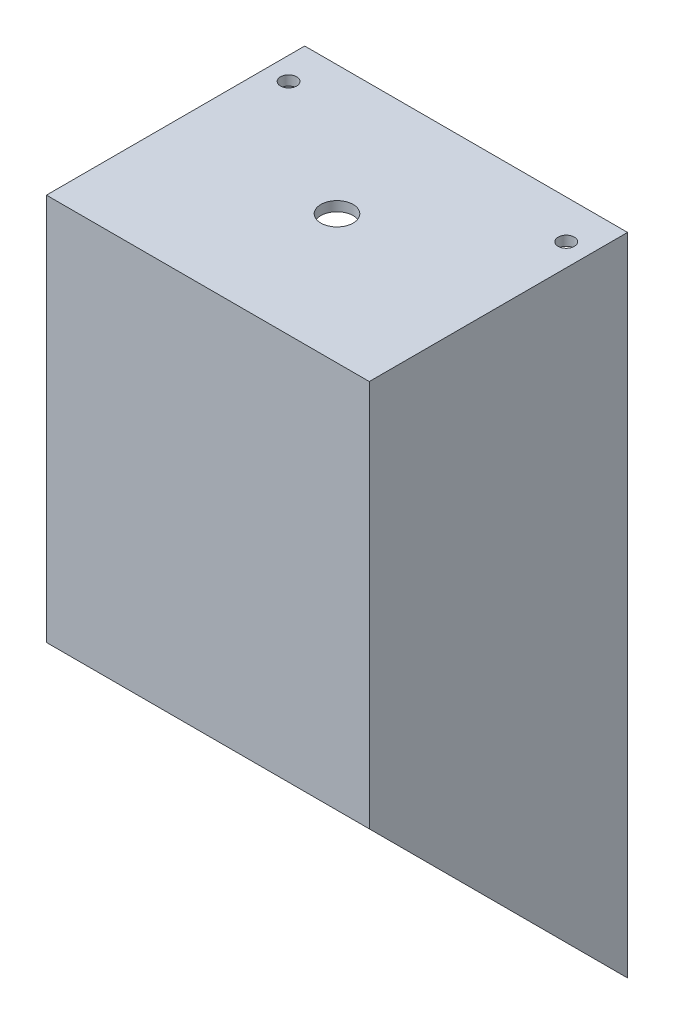
ISO-10303-21;
HEADER;
FILE_DESCRIPTION(('STEP AP214'),'2;1');
FILE_NAME('part.step','',(''),(''),'','','');
FILE_SCHEMA(('AUTOMOTIVE_DESIGN { 1 0 10303 214 1 1 1 1 }'));
ENDSEC;
DATA;
#1=APPLICATION_CONTEXT('core data for automotive mechanical design processes');
#2=APPLICATION_PROTOCOL_DEFINITION('international standard','automotive_design',2000,#1);
#3=PRODUCT_CONTEXT('',#1,'mechanical');
#4=PRODUCT('Part','Part','',(#3));
#5=PRODUCT_RELATED_PRODUCT_CATEGORY('part','',(#4));
#6=PRODUCT_DEFINITION_FORMATION('','',#4);
#7=PRODUCT_DEFINITION_CONTEXT('part definition',#1,'design');
#8=PRODUCT_DEFINITION('design','',#6,#7);
#9=PRODUCT_DEFINITION_SHAPE('','',#8);
#10=(LENGTH_UNIT() NAMED_UNIT(*) SI_UNIT(.MILLI.,.METRE.));
#11=(NAMED_UNIT(*) PLANE_ANGLE_UNIT() SI_UNIT($,.RADIAN.));
#12=(NAMED_UNIT(*) SI_UNIT($,.STERADIAN.) SOLID_ANGLE_UNIT());
#13=UNCERTAINTY_MEASURE_WITH_UNIT(LENGTH_MEASURE(1.E-05),#10,'distance_accuracy_value','');
#14=(GEOMETRIC_REPRESENTATION_CONTEXT(3) GLOBAL_UNCERTAINTY_ASSIGNED_CONTEXT((#13)) GLOBAL_UNIT_ASSIGNED_CONTEXT((#10,
#11,#12)) REPRESENTATION_CONTEXT('',''));
#15=CARTESIAN_POINT('',(0.,0.,0.));
#16=DIRECTION('',(0.,0.,1.));
#17=DIRECTION('',(1.,0.,0.));
#18=AXIS2_PLACEMENT_3D('',#15,#16,#17);
#19=CARTESIAN_POINT('',(0.,-25.,25.));
#20=DIRECTION('',(0.,-0.707106781186547,0.707106781186548));
#21=DIRECTION('',(0.,-0.707106781186548,-0.707106781186547));
#22=AXIS2_PLACEMENT_3D('',#19,#20,#21);
#23=PLANE('',#22);
#24=CARTESIAN_POINT('',(22.5,-30.0000000000001,20.0000000000002));
#25=CARTESIAN_POINT('',(22.5,-28.9587079494324,21.0412920505679));
#26=CARTESIAN_POINT('',(22.2099212789531,-26.8761238482968,23.1238761517032));
#27=CARTESIAN_POINT('',(20.9212883781001,-23.8722965052138,26.1277034947862));
#28=CARTESIAN_POINT('',(18.8286620976702,-21.1039533709797,28.8960466290205));
#29=CARTESIAN_POINT('',(16.0124608920624,-18.6774803197384,31.3225196802619));
#30=CARTESIAN_POINT('',(12.580909794264,-16.6861253500673,33.3138746499327));
#31=CARTESIAN_POINT('',(8.66588138852767,-15.2064151166863,34.7935848833141));
#32=CARTESIAN_POINT('',(4.41782802091241,-14.2952140540327,35.7047859459672));
#33=CARTESIAN_POINT('',(0.,-13.9875391079377,36.0124608920627));
#34=CARTESIAN_POINT('',(-4.41782802091241,-14.2952140540329,35.7047859459674));
#35=CARTESIAN_POINT('',(-8.66588138852768,-15.2064151166861,34.7935848833139));
#36=CARTESIAN_POINT('',(-12.580909794264,-16.6861253500673,33.313874649933));
#37=CARTESIAN_POINT('',(-16.0124608920624,-18.6774803197383,31.3225196802619));
#38=CARTESIAN_POINT('',(-18.8286620976703,-21.1039533709796,28.8960466290202));
#39=CARTESIAN_POINT('',(-20.9212883781001,-23.8722965052138,26.1277034947865));
#40=CARTESIAN_POINT('',(-22.2099212789531,-26.8761238482967,23.1238761517033));
#41=CARTESIAN_POINT('',(-22.6450393605234,-30.,20.0000000000001));
#42=CARTESIAN_POINT('',(-22.2099212789532,-33.123876151703,16.8761238482971));
#43=CARTESIAN_POINT('',(-20.9212883781001,-36.1277034947862,13.8722965052139));
#44=CARTESIAN_POINT('',(-18.8286620976703,-38.8960466290201,11.1039533709798));
#45=CARTESIAN_POINT('',(-16.0124608920624,-41.3225196802616,8.67748031973836));
#46=CARTESIAN_POINT('',(-12.5809097942641,-43.3138746499329,6.68612535006741));
#47=CARTESIAN_POINT('',(-8.66588138852768,-44.7935848833139,5.20641511668618));
#48=CARTESIAN_POINT('',(-4.41782802091242,-45.7047859459672,4.29521405403288));
#49=CARTESIAN_POINT('',(0.,-46.0124608920625,3.9875391079377));
#50=CARTESIAN_POINT('',(4.4178280209124,-45.7047859459671,4.29521405403321));
#51=CARTESIAN_POINT('',(8.66588138852768,-44.793584883314,5.20641511668618));
#52=CARTESIAN_POINT('',(12.580909794264,-43.313874649933,6.68612535006752));
#53=CARTESIAN_POINT('',(16.0124608920624,-41.3225196802617,8.67748031973847));
#54=CARTESIAN_POINT('',(18.8286620976703,-38.8960466290201,11.1039533709796));
#55=CARTESIAN_POINT('',(20.9212883781001,-36.1277034947863,13.872296505214));
#56=CARTESIAN_POINT('',(22.2099212789531,-33.1238761517031,16.8761238482971));
#57=CARTESIAN_POINT('',(22.5,-31.0412920505678,18.9587079494325));
#58=CARTESIAN_POINT('',(22.5,-30.0000000000001,20.0000000000002));
#59=B_SPLINE_CURVE_WITH_KNOTS('',3,(#24,#25,#26,#27,#28,#29,#30,#31,#32,#33,#34,#35,#36,#37,#38,
#39,#40,#41,#42,#43,#44,#45,#46,#47,#48,#49,#50,#51,#52,#53,#54,#55,#56,#57,#58),.UNSPECIFIED.,
.T.,.F.,(4,1,1,1,1,1,1,1,1,1,1,1,1,1,1,1,1,1,1,1,1,1,1,1,1,1,1,1,1,1,1,1,4),(0.,
0.0312499999999997,0.0625000000000006,0.0937499999999999,0.125,0.15625,0.1875,0.21875,0.25,
0.28125,0.3125,0.34375,0.375,0.40625,0.4375,0.46875,0.5,0.53125,0.5625,0.59375,0.625,0.65625,
0.6875,0.71875,0.75,0.78125,0.8125,0.84375,0.875,0.90625,0.9375,0.96875,1.),.UNSPECIFIED.);
#60=CARTESIAN_POINT('',(22.5,-30.0000000000001,20.0000000000002));
#61=VERTEX_POINT('',#60);
#62=EDGE_CURVE('E269',#61,#61,#59,.F.);
#63=ORIENTED_EDGE('',*,*,#62,.T.);
#64=EDGE_LOOP('',(#63));
#65=FACE_BOUND('',#64,.T.);
#66=DIRECTION('',(0.,-0.707106781186548,-0.707106781186547));
#67=VECTOR('',#66,1.);
#68=CARTESIAN_POINT('',(-25.,-9.99999999999999,40.));
#69=LINE('',#68,#67);
#70=CARTESIAN_POINT('',(-25.,-9.99999999999999,40.));
#71=VERTEX_POINT('',#70);
#72=CARTESIAN_POINT('',(-25.,-50.,0.));
#73=VERTEX_POINT('',#72);
#74=EDGE_CURVE('E385',#71,#73,#69,.T.);
#75=ORIENTED_EDGE('',*,*,#74,.T.);
#76=DIRECTION('',(1.,0.,0.));
#77=VECTOR('',#76,1.);
#78=CARTESIAN_POINT('',(-25.,-50.,0.));
#79=LINE('',#78,#77);
#80=CARTESIAN_POINT('',(25.,-50.,0.));
#81=VERTEX_POINT('',#80);
#82=EDGE_CURVE('E435',#73,#81,#79,.T.);
#83=ORIENTED_EDGE('',*,*,#82,.T.);
#84=DIRECTION('',(0.,-0.707106781186548,-0.707106781186547));
#85=VECTOR('',#84,1.);
#86=CARTESIAN_POINT('',(25.,-9.99999999999999,40.));
#87=LINE('',#86,#85);
#88=CARTESIAN_POINT('',(25.,-9.99999999999999,40.));
#89=VERTEX_POINT('',#88);
#90=EDGE_CURVE('E391',#89,#81,#87,.T.);
#91=ORIENTED_EDGE('',*,*,#90,.F.);
#92=DIRECTION('',(1.,0.,0.));
#93=VECTOR('',#92,1.);
#94=CARTESIAN_POINT('',(-25.,-9.99999999999999,40.));
#95=LINE('',#94,#93);
#96=EDGE_CURVE('E352',#71,#89,#95,.T.);
#97=ORIENTED_EDGE('',*,*,#96,.F.);
#98=EDGE_LOOP('',(#75,#83,#91,#97));
#99=FACE_BOUND('',#98,.T.);
#100=DIRECTION('',(-0.377964473009235,-0.654653670707975,-0.654653670707975));
#101=VECTOR('',#100,1.);
#102=CARTESIAN_POINT('',(-5.6316316232872,-23.3742879831591,26.6257120168409));
#103=LINE('',#102,#101);
#104=CARTESIAN_POINT('',(-19.7766433543863,-47.87416697508,2.12583302492004));
#105=VERTEX_POINT('',#104);
#106=CARTESIAN_POINT('',(-20.4266433543863,-48.9999999999997,1.00000000000029));
#107=VERTEX_POINT('',#106);
#108=EDGE_CURVE('E234',#105,#107,#103,.T.);
#109=ORIENTED_EDGE('',*,*,#108,.T.);
#110=DIRECTION('',(-0.377964473009229,0.654653670707977,0.654653670707976));
#111=VECTOR('',#110,1.);
#112=CARTESIAN_POINT('',(-29.3854712699461,-33.4828548739838,16.5171451260162));
#113=LINE('',#112,#111);
#114=CARTESIAN_POINT('',(-21.0766433543863,-47.87416697508,2.12583302492004));
#115=VERTEX_POINT('',#114);
#116=EDGE_CURVE('E192',#107,#115,#113,.T.);
#117=ORIENTED_EDGE('',*,*,#116,.T.);
#118=DIRECTION('',(1.,0.,0.));
#119=VECTOR('',#118,1.);
#120=CARTESIAN_POINT('',(0.,-47.87416697508,2.12583302492004));
#121=LINE('',#120,#119);
#122=EDGE_CURVE('E243',#115,#105,#121,.T.);
#123=ORIENTED_EDGE('',*,*,#122,.T.);
#124=EDGE_LOOP('',(#109,#117,#123));
#125=FACE_BOUND('',#124,.T.);
#126=DIRECTION('',(-0.377964473009235,-0.654653670707975,-0.654653670707975));
#127=VECTOR('',#126,1.);
#128=CARTESIAN_POINT('',(11.5112255195699,-28.3230045762132,21.6769954237868));
#129=LINE('',#128,#127);
#130=CARTESIAN_POINT('',(0.223356645613727,-47.8741669750801,2.1258330249199));
#131=VERTEX_POINT('',#130);
#132=CARTESIAN_POINT('',(-0.42664335438628,-48.9999999999999,1.00000000000014));
#133=VERTEX_POINT('',#132);
#134=EDGE_CURVE('E247',#131,#133,#129,.T.);
#135=ORIENTED_EDGE('',*,*,#134,.T.);
#136=DIRECTION('',(-0.377964473009229,0.654653670707977,0.654653670707976));
#137=VECTOR('',#136,1.);
#138=CARTESIAN_POINT('',(-12.2426141270891,-28.5341382809298,21.4658617190702));
#139=LINE('',#138,#137);
#140=CARTESIAN_POINT('',(-1.07664335438629,-47.8741669750801,2.12583302491991));
#141=VERTEX_POINT('',#140);
#142=EDGE_CURVE('E253',#133,#141,#139,.T.);
#143=ORIENTED_EDGE('',*,*,#142,.T.);
#144=DIRECTION('',(1.,0.,0.));
#145=VECTOR('',#144,1.);
#146=CARTESIAN_POINT('',(0.,-47.8741669750801,2.12583302491991));
#147=LINE('',#146,#145);
#148=EDGE_CURVE('E250',#141,#131,#147,.T.);
#149=ORIENTED_EDGE('',*,*,#148,.T.);
#150=EDGE_LOOP('',(#135,#143,#149));
#151=FACE_BOUND('',#150,.T.);
#152=DIRECTION('',(-0.377964473009233,-0.654653670707976,-0.654653670707975));
#153=VECTOR('',#152,1.);
#154=CARTESIAN_POINT('',(28.654082662427,-33.2717211692671,16.7282788307329));
#155=LINE('',#154,#153);
#156=CARTESIAN_POINT('',(20.2233566456137,-47.8741669750802,2.12583302491977));
#157=VERTEX_POINT('',#156);
#158=CARTESIAN_POINT('',(19.5733566456137,-49.,1.));
#159=VERTEX_POINT('',#158);
#160=EDGE_CURVE('E256',#157,#159,#155,.T.);
#161=ORIENTED_EDGE('',*,*,#160,.T.);
#162=DIRECTION('',(-0.377964473009229,0.654653670707977,0.654653670707976));
#163=VECTOR('',#162,1.);
#164=CARTESIAN_POINT('',(4.90024301576794,-23.5854216878759,26.4145783121241));
#165=LINE('',#164,#163);
#166=CARTESIAN_POINT('',(18.9233566456137,-47.8741669750802,2.12583302491977));
#167=VERTEX_POINT('',#166);
#168=EDGE_CURVE('E262',#159,#167,#165,.T.);
#169=ORIENTED_EDGE('',*,*,#168,.T.);
#170=DIRECTION('',(1.,0.,0.));
#171=VECTOR('',#170,1.);
#172=CARTESIAN_POINT('',(0.,-47.8741669750802,2.12583302491976));
#173=LINE('',#172,#171);
#174=EDGE_CURVE('E259',#167,#157,#173,.T.);
#175=ORIENTED_EDGE('',*,*,#174,.T.);
#176=EDGE_LOOP('',(#161,#169,#175));
#177=FACE_BOUND('',#176,.T.);
#178=ADVANCED_FACE('F53',(#65,#99,#125,#151,#177),#23,.T.);
#179=CARTESIAN_POINT('',(0.,-23.9393398282202,23.9393398282202));
#180=DIRECTION('',(0.,-0.707106781186547,0.707106781186548));
#181=DIRECTION('',(0.,-0.707106781186548,-0.707106781186547));
#182=AXIS2_PLACEMENT_3D('',#179,#180,#181);
#183=PLANE('',#182);
#184=DIRECTION('',(-0.377964473009229,0.654653670707977,0.654653670707976));
#185=VECTOR('',#184,1.);
#186=CARTESIAN_POINT('',(-11.7177234679213,-27.3219552274672,20.5567244289732));
#187=LINE('',#186,#185);
#188=CARTESIAN_POINT('',(-0.426643354386285,-46.8786796564402,1.00000000000014));
#189=VERTEX_POINT('',#188);
#190=CARTESIAN_POINT('',(-1.07664335438629,-45.7528466315205,2.12583302491991));
#191=VERTEX_POINT('',#190);
#192=EDGE_CURVE('E206',#189,#191,#187,.T.);
#193=ORIENTED_EDGE('',*,*,#192,.F.);
#194=DIRECTION('',(-0.377964473009235,-0.654653670707975,-0.654653670707975));
#195=VECTOR('',#194,1.);
#196=CARTESIAN_POINT('',(10.9863348604021,-27.1108215227505,20.7678581336899));
#197=LINE('',#196,#195);
#198=CARTESIAN_POINT('',(0.22335664561373,-45.7528466315205,2.12583302491991));
#199=VERTEX_POINT('',#198);
#200=EDGE_CURVE('E198',#199,#189,#197,.T.);
#201=ORIENTED_EDGE('',*,*,#200,.F.);
#202=DIRECTION('',(1.,0.,0.));
#203=VECTOR('',#202,1.);
#204=CARTESIAN_POINT('',(0.,-45.7528466315205,2.1258330249199));
#205=LINE('',#204,#203);
#206=EDGE_CURVE('E200',#191,#199,#205,.T.);
#207=ORIENTED_EDGE('',*,*,#206,.F.);
#208=EDGE_LOOP('',(#193,#201,#207));
#209=FACE_BOUND('',#208,.T.);
#210=DIRECTION('',(0.,-0.707106781186548,-0.707106781186547));
#211=VECTOR('',#210,1.);
#212=CARTESIAN_POINT('',(-23.5,-23.9393398282202,23.9393398282202));
#213=LINE('',#212,#211);
#214=CARTESIAN_POINT('',(-23.5,-9.37867965644035,38.5));
#215=VERTEX_POINT('',#214);
#216=CARTESIAN_POINT('',(-23.5,-47.8786796564404,0.));
#217=VERTEX_POINT('',#216);
#218=EDGE_CURVE('E802',#215,#217,#213,.T.);
#219=ORIENTED_EDGE('',*,*,#218,.F.);
#220=DIRECTION('',(1.,0.,0.));
#221=VECTOR('',#220,1.);
#222=CARTESIAN_POINT('',(0.,-9.37867965644035,38.5));
#223=LINE('',#222,#221);
#224=CARTESIAN_POINT('',(23.5,-9.37867965644035,38.5));
#225=VERTEX_POINT('',#224);
#226=EDGE_CURVE('E806',#215,#225,#223,.T.);
#227=ORIENTED_EDGE('',*,*,#226,.T.);
#228=DIRECTION('',(0.,-0.707106781186548,-0.707106781186547));
#229=VECTOR('',#228,1.);
#230=CARTESIAN_POINT('',(23.5,-23.9393398282202,23.9393398282202));
#231=LINE('',#230,#229);
#232=CARTESIAN_POINT('',(23.5,-47.8786796564404,0.));
#233=VERTEX_POINT('',#232);
#234=EDGE_CURVE('E793',#225,#233,#231,.T.);
#235=ORIENTED_EDGE('',*,*,#234,.T.);
#236=DIRECTION('',(1.,0.,0.));
#237=VECTOR('',#236,1.);
#238=CARTESIAN_POINT('',(0.,-47.8786796564404,0.));
#239=LINE('',#238,#237);
#240=EDGE_CURVE('E823',#217,#233,#239,.T.);
#241=ORIENTED_EDGE('',*,*,#240,.F.);
#242=EDGE_LOOP('',(#219,#227,#235,#241));
#243=FACE_BOUND('',#242,.T.);
#244=CARTESIAN_POINT('',(22.5,-28.9393398282202,18.9393398282203));
#245=CARTESIAN_POINT('',(22.5,-27.8980477776525,19.980631878788));
#246=CARTESIAN_POINT('',(22.2099212789531,-25.815463676517,22.0632159799233));
#247=CARTESIAN_POINT('',(20.9212883781001,-22.811636333434,25.0670433230064));
#248=CARTESIAN_POINT('',(18.8286620976702,-20.0432931991998,27.8353864572406));
#249=CARTESIAN_POINT('',(16.0124608920624,-17.6168201479585,30.261859508482));
#250=CARTESIAN_POINT('',(12.580909794264,-15.6254651782874,32.2532144781529));
#251=CARTESIAN_POINT('',(8.66588138852767,-14.1457549449064,33.7329247115342));
#252=CARTESIAN_POINT('',(4.41782802091241,-13.2345538822528,34.6441257741873));
#253=CARTESIAN_POINT('',(0.,-12.9268789361578,34.9518007202828));
#254=CARTESIAN_POINT('',(-4.41782802091241,-13.234553882253,34.6441257741875));
#255=CARTESIAN_POINT('',(-8.66588138852768,-14.1457549449062,33.732924711534));
#256=CARTESIAN_POINT('',(-12.580909794264,-15.6254651782874,32.2532144781531));
#257=CARTESIAN_POINT('',(-16.0124608920624,-17.6168201479584,30.261859508482));
#258=CARTESIAN_POINT('',(-18.8286620976703,-20.0432931991997,27.8353864572404));
#259=CARTESIAN_POINT('',(-20.9212883781001,-22.811636333434,25.0670433230067));
#260=CARTESIAN_POINT('',(-22.2099212789531,-25.8154636765169,22.0632159799234));
#261=CARTESIAN_POINT('',(-22.6450393605234,-28.9393398282202,18.9393398282203));
#262=CARTESIAN_POINT('',(-22.2099212789532,-32.0632159799231,15.8154636765172));
#263=CARTESIAN_POINT('',(-20.9212883781001,-35.0670433230064,12.8116363334341));
#264=CARTESIAN_POINT('',(-18.8286620976703,-37.8353864572403,10.0432931991999));
#265=CARTESIAN_POINT('',(-16.0124608920624,-40.2618595084817,7.6168201479585));
#266=CARTESIAN_POINT('',(-12.5809097942641,-42.253214478153,5.62546517828755));
#267=CARTESIAN_POINT('',(-8.66588138852768,-43.732924711534,4.14575494490632));
#268=CARTESIAN_POINT('',(-4.41782802091242,-44.6441257741873,3.23455388225302));
#269=CARTESIAN_POINT('',(0.,-44.9518007202826,2.92687893615784));
#270=CARTESIAN_POINT('',(4.4178280209124,-44.6441257741872,3.23455388225335));
#271=CARTESIAN_POINT('',(8.66588138852768,-43.7329247115341,4.14575494490632));
#272=CARTESIAN_POINT('',(12.580909794264,-42.2532144781531,5.62546517828766));
#273=CARTESIAN_POINT('',(16.0124608920624,-40.2618595084818,7.61682014795861));
#274=CARTESIAN_POINT('',(18.8286620976703,-37.8353864572403,10.0432931991997));
#275=CARTESIAN_POINT('',(20.9212883781001,-35.0670433230065,12.8116363334342));
#276=CARTESIAN_POINT('',(22.2099212789531,-32.0632159799232,15.8154636765172));
#277=CARTESIAN_POINT('',(22.5,-29.9806318787879,17.8980477776527));
#278=CARTESIAN_POINT('',(22.5,-28.9393398282202,18.9393398282203));
#279=B_SPLINE_CURVE_WITH_KNOTS('',3,(#244,#245,#246,#247,#248,#249,#250,#251,#252,#253,#254,
#255,#256,#257,#258,#259,#260,#261,#262,#263,#264,#265,#266,#267,#268,#269,#270,#271,#272,#273,
#274,#275,#276,#277,#278),.UNSPECIFIED.,.T.,.F.,(4,1,1,1,1,1,1,1,1,1,1,1,1,1,1,1,1,1,1,1,1,1,1,
1,1,1,1,1,1,1,1,1,4),(0.,0.0312499999999997,0.0625000000000006,0.0937499999999999,0.125,0.15625,
0.1875,0.21875,0.25,0.28125,0.3125,0.34375,0.375,0.40625,0.4375,0.46875,0.5,0.53125,0.5625,
0.59375,0.625,0.65625,0.6875,0.71875,0.75,0.78125,0.8125,0.84375,0.875,0.90625,0.9375,0.96875,
1.),.UNSPECIFIED.);
#280=CARTESIAN_POINT('',(22.5,-28.9393398282202,18.9393398282203));
#281=VERTEX_POINT('',#280);
#282=EDGE_CURVE('E274',#281,#281,#279,.F.);
#283=ORIENTED_EDGE('',*,*,#282,.F.);
#284=EDGE_LOOP('',(#283));
#285=FACE_BOUND('',#284,.T.);
#286=DIRECTION('',(-0.377964473009229,0.654653670707977,0.654653670707976));
#287=VECTOR('',#286,1.);
#288=CARTESIAN_POINT('',(-28.8605806107783,-32.2706718205211,15.6080078359192));
#289=LINE('',#288,#287);
#290=CARTESIAN_POINT('',(-20.4266433543863,-46.8786796564401,1.00000000000028));
#291=VERTEX_POINT('',#290);
#292=CARTESIAN_POINT('',(-21.0766433543863,-45.7528466315203,2.12583302492004));
#293=VERTEX_POINT('',#292);
#294=EDGE_CURVE('E189',#291,#293,#289,.T.);
#295=ORIENTED_EDGE('',*,*,#294,.F.);
#296=DIRECTION('',(-0.377964473009235,-0.654653670707975,-0.654653670707975));
#297=VECTOR('',#296,1.);
#298=CARTESIAN_POINT('',(-6.15652228245503,-22.1621049296965,25.7165747267439));
#299=LINE('',#298,#297);
#300=CARTESIAN_POINT('',(-19.7766433543863,-45.7528466315203,2.12583302492004));
#301=VERTEX_POINT('',#300);
#302=EDGE_CURVE('E172',#301,#291,#299,.T.);
#303=ORIENTED_EDGE('',*,*,#302,.F.);
#304=DIRECTION('',(1.,0.,0.));
#305=VECTOR('',#304,1.);
#306=CARTESIAN_POINT('',(0.,-45.7528466315203,2.12583302492004));
#307=LINE('',#306,#305);
#308=EDGE_CURVE('E183',#293,#301,#307,.T.);
#309=ORIENTED_EDGE('',*,*,#308,.F.);
#310=EDGE_LOOP('',(#295,#303,#309));
#311=FACE_BOUND('',#310,.T.);
#312=DIRECTION('',(-0.377964473009229,0.654653670707977,0.654653670707976));
#313=VECTOR('',#312,1.);
#314=CARTESIAN_POINT('',(5.42513367493577,-22.3732386344132,25.5054410220271));
#315=LINE('',#314,#313);
#316=CARTESIAN_POINT('',(19.5733566456137,-46.8786796564404,1.));
#317=VERTEX_POINT('',#316);
#318=CARTESIAN_POINT('',(18.9233566456137,-45.7528466315206,2.12583302491977));
#319=VERTEX_POINT('',#318);
#320=EDGE_CURVE('E12',#317,#319,#315,.T.);
#321=ORIENTED_EDGE('',*,*,#320,.F.);
#322=DIRECTION('',(-0.377964473009233,-0.654653670707976,-0.654653670707975));
#323=VECTOR('',#322,1.);
#324=CARTESIAN_POINT('',(28.1291920032591,-32.0595381158045,15.8191415406359));
#325=LINE('',#324,#323);
#326=CARTESIAN_POINT('',(20.2233566456137,-45.7528466315206,2.12583302491977));
#327=VERTEX_POINT('',#326);
#328=EDGE_CURVE('E208',#327,#317,#325,.T.);
#329=ORIENTED_EDGE('',*,*,#328,.F.);
#330=DIRECTION('',(1.,0.,0.));
#331=VECTOR('',#330,1.);
#332=CARTESIAN_POINT('',(0.,-45.7528466315206,2.12583302491976));
#333=LINE('',#332,#331);
#334=EDGE_CURVE('E62',#319,#327,#333,.T.);
#335=ORIENTED_EDGE('',*,*,#334,.F.);
#336=EDGE_LOOP('',(#321,#329,#335));
#337=FACE_BOUND('',#336,.T.);
#338=ADVANCED_FACE('F196',(#209,#243,#285,#311,#337),#183,.F.);
#339=CARTESIAN_POINT('',(0.,0.,0.));
#340=DIRECTION('',(0.,0.,1.));
#341=DIRECTION('',(1.,0.,0.));
#342=AXIS2_PLACEMENT_3D('',#339,#340,#341);
#343=PLANE('',#342);
#344=ORIENTED_EDGE('',*,*,#240,.T.);
#345=DIRECTION('',(0.,1.,0.));
#346=VECTOR('',#345,1.);
#347=CARTESIAN_POINT('',(23.5,0.,0.));
#348=LINE('',#347,#346);
#349=CARTESIAN_POINT('',(23.5,48.5,0.));
#350=VERTEX_POINT('',#349);
#351=EDGE_CURVE('E798',#233,#350,#348,.T.);
#352=ORIENTED_EDGE('',*,*,#351,.T.);
#353=DIRECTION('',(-1.,0.,0.));
#354=VECTOR('',#353,1.);
#355=CARTESIAN_POINT('',(0.,48.5,0.));
#356=LINE('',#355,#354);
#357=CARTESIAN_POINT('',(-23.5,48.5,0.));
#358=VERTEX_POINT('',#357);
#359=EDGE_CURVE('E386',#350,#358,#356,.T.);
#360=ORIENTED_EDGE('',*,*,#359,.T.);
#361=DIRECTION('',(0.,-1.,0.));
#362=VECTOR('',#361,1.);
#363=CARTESIAN_POINT('',(-23.5,0.,0.));
#364=LINE('',#363,#362);
#365=EDGE_CURVE('E821',#358,#217,#364,.T.);
#366=ORIENTED_EDGE('',*,*,#365,.T.);
#367=EDGE_LOOP('',(#344,#352,#360,#366));
#368=FACE_BOUND('',#367,.T.);
#369=DIRECTION('',(0.,1.,0.));
#370=VECTOR('',#369,1.);
#371=CARTESIAN_POINT('',(25.,50.,0.));
#372=LINE('',#371,#370);
#373=CARTESIAN_POINT('',(25.,50.,0.));
#374=VERTEX_POINT('',#373);
#375=EDGE_CURVE('E457',#81,#374,#372,.T.);
#376=ORIENTED_EDGE('',*,*,#375,.F.);
#377=ORIENTED_EDGE('',*,*,#82,.F.);
#378=DIRECTION('',(0.,-1.,0.));
#379=VECTOR('',#378,1.);
#380=CARTESIAN_POINT('',(-25.,50.,0.));
#381=LINE('',#380,#379);
#382=CARTESIAN_POINT('',(-25.,50.,0.));
#383=VERTEX_POINT('',#382);
#384=EDGE_CURVE('E444',#383,#73,#381,.T.);
#385=ORIENTED_EDGE('',*,*,#384,.F.);
#386=DIRECTION('',(-1.,0.,0.));
#387=VECTOR('',#386,1.);
#388=CARTESIAN_POINT('',(-25.,50.,0.));
#389=LINE('',#388,#387);
#390=EDGE_CURVE('E184',#374,#383,#389,.T.);
#391=ORIENTED_EDGE('',*,*,#390,.F.);
#392=EDGE_LOOP('',(#376,#377,#385,#391));
#393=FACE_BOUND('',#392,.T.);
#394=ADVANCED_FACE('F321',(#368,#393),#343,.F.);
#395=CARTESIAN_POINT('',(0.,0.,40.));
#396=DIRECTION('',(0.,0.,1.));
#397=DIRECTION('',(1.,0.,0.));
#398=AXIS2_PLACEMENT_3D('',#395,#396,#397);
#399=PLANE('',#398);
#400=DIRECTION('',(0.,-1.,0.));
#401=VECTOR('',#400,1.);
#402=CARTESIAN_POINT('',(-25.,50.,40.));
#403=LINE('',#402,#401);
#404=CARTESIAN_POINT('',(-25.,50.,40.));
#405=VERTEX_POINT('',#404);
#406=EDGE_CURVE('E360',#405,#71,#403,.T.);
#407=ORIENTED_EDGE('',*,*,#406,.T.);
#408=ORIENTED_EDGE('',*,*,#96,.T.);
#409=DIRECTION('',(0.,1.,0.));
#410=VECTOR('',#409,1.);
#411=CARTESIAN_POINT('',(25.,50.,40.));
#412=LINE('',#411,#410);
#413=CARTESIAN_POINT('',(25.,50.,40.));
#414=VERTEX_POINT('',#413);
#415=EDGE_CURVE('E359',#89,#414,#412,.T.);
#416=ORIENTED_EDGE('',*,*,#415,.T.);
#417=DIRECTION('',(-1.,0.,0.));
#418=VECTOR('',#417,1.);
#419=CARTESIAN_POINT('',(-25.,50.,40.));
#420=LINE('',#419,#418);
#421=EDGE_CURVE('E365',#414,#405,#420,.T.);
#422=ORIENTED_EDGE('',*,*,#421,.T.);
#423=EDGE_LOOP('',(#407,#408,#416,#422));
#424=FACE_BOUND('',#423,.T.);
#425=ADVANCED_FACE('F323',(#424),#399,.T.);
#426=CARTESIAN_POINT('',(0.,50.,0.));
#427=DIRECTION('',(0.,1.,0.));
#428=DIRECTION('',(0.,0.,1.));
#429=AXIS2_PLACEMENT_3D('',#426,#427,#428);
#430=PLANE('',#429);
#431=CARTESIAN_POINT('',(21.5,50.,5.99999999999999));
#432=DIRECTION('',(0.,1.,0.));
#433=DIRECTION('',(0.,0.,1.));
#434=AXIS2_PLACEMENT_3D('',#431,#432,#433);
#435=CIRCLE('',#434,1.25);
#436=CARTESIAN_POINT('',(21.5,50.,7.25));
#437=VERTEX_POINT('',#436);
#438=EDGE_CURVE('E768',#437,#437,#435,.T.);
#439=ORIENTED_EDGE('',*,*,#438,.F.);
#440=EDGE_LOOP('',(#439));
#441=FACE_BOUND('',#440,.T.);
#442=CARTESIAN_POINT('',(-21.5,50.,6.));
#443=DIRECTION('',(0.,1.,0.));
#444=DIRECTION('',(0.,0.,1.));
#445=AXIS2_PLACEMENT_3D('',#442,#443,#444);
#446=CIRCLE('',#445,1.25);
#447=CARTESIAN_POINT('',(-21.5,50.,7.25));
#448=VERTEX_POINT('',#447);
#449=EDGE_CURVE('E776',#448,#448,#446,.T.);
#450=ORIENTED_EDGE('',*,*,#449,.F.);
#451=EDGE_LOOP('',(#450));
#452=FACE_BOUND('',#451,.T.);
#453=CARTESIAN_POINT('',(0.,50.,20.));
#454=DIRECTION('',(0.,1.,0.));
#455=DIRECTION('',(0.,0.,1.));
#456=AXIS2_PLACEMENT_3D('',#453,#454,#455);
#457=CIRCLE('',#456,2.5);
#458=CARTESIAN_POINT('',(0.,50.,22.5));
#459=VERTEX_POINT('',#458);
#460=EDGE_CURVE('E265',#459,#459,#457,.T.);
#461=ORIENTED_EDGE('',*,*,#460,.F.);
#462=EDGE_LOOP('',(#461));
#463=FACE_BOUND('',#462,.T.);
#464=DIRECTION('',(0.,0.,-1.));
#465=VECTOR('',#464,1.);
#466=CARTESIAN_POINT('',(25.,50.,40.));
#467=LINE('',#466,#465);
#468=EDGE_CURVE('E376',#414,#374,#467,.T.);
#469=ORIENTED_EDGE('',*,*,#468,.T.);
#470=ORIENTED_EDGE('',*,*,#390,.T.);
#471=DIRECTION('',(0.,0.,-1.));
#472=VECTOR('',#471,1.);
#473=CARTESIAN_POINT('',(-25.,50.,40.));
#474=LINE('',#473,#472);
#475=EDGE_CURVE('E382',#405,#383,#474,.T.);
#476=ORIENTED_EDGE('',*,*,#475,.F.);
#477=ORIENTED_EDGE('',*,*,#421,.F.);
#478=EDGE_LOOP('',(#469,#470,#476,#477));
#479=FACE_BOUND('',#478,.T.);
#480=ADVANCED_FACE('F327',(#441,#452,#463,#479),#430,.T.);
#481=CARTESIAN_POINT('',(-25.,0.,0.));
#482=DIRECTION('',(-1.,0.,0.));
#483=DIRECTION('',(0.,-1.,0.));
#484=AXIS2_PLACEMENT_3D('',#481,#482,#483);
#485=PLANE('',#484);
#486=ORIENTED_EDGE('',*,*,#475,.T.);
#487=ORIENTED_EDGE('',*,*,#384,.T.);
#488=ORIENTED_EDGE('',*,*,#74,.F.);
#489=ORIENTED_EDGE('',*,*,#406,.F.);
#490=EDGE_LOOP('',(#486,#487,#488,#489));
#491=FACE_BOUND('',#490,.T.);
#492=ADVANCED_FACE('F381',(#491),#485,.T.);
#493=CARTESIAN_POINT('',(25.,0.,0.));
#494=DIRECTION('',(1.,0.,0.));
#495=DIRECTION('',(0.,0.,-1.));
#496=AXIS2_PLACEMENT_3D('',#493,#494,#495);
#497=PLANE('',#496);
#498=ORIENTED_EDGE('',*,*,#90,.T.);
#499=ORIENTED_EDGE('',*,*,#375,.T.);
#500=ORIENTED_EDGE('',*,*,#468,.F.);
#501=ORIENTED_EDGE('',*,*,#415,.F.);
#502=EDGE_LOOP('',(#498,#499,#500,#501));
#503=FACE_BOUND('',#502,.T.);
#504=ADVANCED_FACE('F307',(#503),#497,.T.);
#505=CARTESIAN_POINT('',(0.,0.,38.5));
#506=DIRECTION('',(0.,0.,1.));
#507=DIRECTION('',(1.,0.,0.));
#508=AXIS2_PLACEMENT_3D('',#505,#506,#507);
#509=PLANE('',#508);
#510=DIRECTION('',(0.,-1.,0.));
#511=VECTOR('',#510,1.);
#512=CARTESIAN_POINT('',(-23.5,0.,38.5));
#513=LINE('',#512,#511);
#514=CARTESIAN_POINT('',(-23.5,48.5,38.5));
#515=VERTEX_POINT('',#514);
#516=EDGE_CURVE('E282',#515,#215,#513,.T.);
#517=ORIENTED_EDGE('',*,*,#516,.F.);
#518=DIRECTION('',(-1.,0.,0.));
#519=VECTOR('',#518,1.);
#520=CARTESIAN_POINT('',(0.,48.5,38.5));
#521=LINE('',#520,#519);
#522=CARTESIAN_POINT('',(23.5,48.5,38.5));
#523=VERTEX_POINT('',#522);
#524=EDGE_CURVE('E810',#523,#515,#521,.T.);
#525=ORIENTED_EDGE('',*,*,#524,.F.);
#526=DIRECTION('',(0.,1.,0.));
#527=VECTOR('',#526,1.);
#528=CARTESIAN_POINT('',(23.5,0.,38.5));
#529=LINE('',#528,#527);
#530=EDGE_CURVE('E796',#225,#523,#529,.T.);
#531=ORIENTED_EDGE('',*,*,#530,.F.);
#532=ORIENTED_EDGE('',*,*,#226,.F.);
#533=EDGE_LOOP('',(#517,#525,#531,#532));
#534=FACE_BOUND('',#533,.T.);
#535=ADVANCED_FACE('F303',(#534),#509,.F.);
#536=CARTESIAN_POINT('',(0.,48.5,0.));
#537=DIRECTION('',(0.,1.,0.));
#538=DIRECTION('',(0.,0.,1.));
#539=AXIS2_PLACEMENT_3D('',#536,#537,#538);
#540=PLANE('',#539);
#541=CARTESIAN_POINT('',(21.5,48.5,5.99999999999999));
#542=DIRECTION('',(0.,1.,0.));
#543=DIRECTION('',(0.,0.,1.));
#544=AXIS2_PLACEMENT_3D('',#541,#542,#543);
#545=CIRCLE('',#544,1.25);
#546=CARTESIAN_POINT('',(21.5,48.5,7.25));
#547=VERTEX_POINT('',#546);
#548=EDGE_CURVE('E771',#547,#547,#545,.F.);
#549=ORIENTED_EDGE('',*,*,#548,.F.);
#550=EDGE_LOOP('',(#549));
#551=FACE_BOUND('',#550,.T.);
#552=CARTESIAN_POINT('',(-21.5,48.5,6.));
#553=DIRECTION('',(0.,1.,0.));
#554=DIRECTION('',(0.,0.,1.));
#555=AXIS2_PLACEMENT_3D('',#552,#553,#554);
#556=CIRCLE('',#555,1.25);
#557=CARTESIAN_POINT('',(-21.5,48.5,7.25));
#558=VERTEX_POINT('',#557);
#559=EDGE_CURVE('E772',#558,#558,#556,.F.);
#560=ORIENTED_EDGE('',*,*,#559,.F.);
#561=EDGE_LOOP('',(#560));
#562=FACE_BOUND('',#561,.T.);
#563=CARTESIAN_POINT('',(0.,48.5,20.));
#564=DIRECTION('',(0.,1.,0.));
#565=DIRECTION('',(0.,0.,1.));
#566=AXIS2_PLACEMENT_3D('',#563,#564,#565);
#567=CIRCLE('',#566,2.5);
#568=CARTESIAN_POINT('',(0.,48.5,22.5));
#569=VERTEX_POINT('',#568);
#570=EDGE_CURVE('E268',#569,#569,#567,.T.);
#571=ORIENTED_EDGE('',*,*,#570,.T.);
#572=EDGE_LOOP('',(#571));
#573=FACE_BOUND('',#572,.T.);
#574=DIRECTION('',(0.,0.,-1.));
#575=VECTOR('',#574,1.);
#576=CARTESIAN_POINT('',(23.5,48.5,0.));
#577=LINE('',#576,#575);
#578=EDGE_CURVE('E814',#523,#350,#577,.T.);
#579=ORIENTED_EDGE('',*,*,#578,.F.);
#580=ORIENTED_EDGE('',*,*,#524,.T.);
#581=DIRECTION('',(0.,0.,-1.));
#582=VECTOR('',#581,1.);
#583=CARTESIAN_POINT('',(-23.5,48.5,0.));
#584=LINE('',#583,#582);
#585=EDGE_CURVE('E803',#515,#358,#584,.T.);
#586=ORIENTED_EDGE('',*,*,#585,.T.);
#587=ORIENTED_EDGE('',*,*,#359,.F.);
#588=EDGE_LOOP('',(#579,#580,#586,#587));
#589=FACE_BOUND('',#588,.T.);
#590=ADVANCED_FACE('F306',(#551,#562,#573,#589),#540,.F.);
#591=CARTESIAN_POINT('',(-23.5,0.,0.));
#592=DIRECTION('',(-1.,0.,0.));
#593=DIRECTION('',(0.,-1.,0.));
#594=AXIS2_PLACEMENT_3D('',#591,#592,#593);
#595=PLANE('',#594);
#596=CARTESIAN_POINT('',(-23.5,-23.5,6.));
#597=DIRECTION('',(1.,0.,0.));
#598=DIRECTION('',(0.,1.,0.));
#599=AXIS2_PLACEMENT_3D('',#596,#597,#598);
#600=CIRCLE('',#599,1.5);
#601=CARTESIAN_POINT('',(-23.5,-22.,6.));
#602=VERTEX_POINT('',#601);
#603=EDGE_CURVE('E214',#602,#602,#600,.T.);
#604=ORIENTED_EDGE('',*,*,#603,.F.);
#605=EDGE_LOOP('',(#604));
#606=FACE_BOUND('',#605,.T.);
#607=ORIENTED_EDGE('',*,*,#585,.F.);
#608=ORIENTED_EDGE('',*,*,#516,.T.);
#609=ORIENTED_EDGE('',*,*,#218,.T.);
#610=ORIENTED_EDGE('',*,*,#365,.F.);
#611=EDGE_LOOP('',(#607,#608,#609,#610));
#612=FACE_BOUND('',#611,.T.);
#613=ADVANCED_FACE('F311',(#606,#612),#595,.F.);
#614=CARTESIAN_POINT('',(23.5,0.,0.));
#615=DIRECTION('',(1.,0.,0.));
#616=DIRECTION('',(0.,0.,-1.));
#617=AXIS2_PLACEMENT_3D('',#614,#615,#616);
#618=PLANE('',#617);
#619=CARTESIAN_POINT('',(23.5,-23.5,6.00000000000001));
#620=DIRECTION('',(-1.,0.,0.));
#621=DIRECTION('',(0.,0.,1.));
#622=AXIS2_PLACEMENT_3D('',#619,#620,#621);
#623=CIRCLE('',#622,1.5);
#624=CARTESIAN_POINT('',(23.5,-23.5,7.50000000000001));
#625=VERTEX_POINT('',#624);
#626=EDGE_CURVE('E223',#625,#625,#623,.T.);
#627=ORIENTED_EDGE('',*,*,#626,.F.);
#628=EDGE_LOOP('',(#627));
#629=FACE_BOUND('',#628,.T.);
#630=ORIENTED_EDGE('',*,*,#234,.F.);
#631=ORIENTED_EDGE('',*,*,#530,.T.);
#632=ORIENTED_EDGE('',*,*,#578,.T.);
#633=ORIENTED_EDGE('',*,*,#351,.F.);
#634=EDGE_LOOP('',(#630,#631,#632,#633));
#635=FACE_BOUND('',#634,.T.);
#636=ADVANCED_FACE('F300',(#629,#635),#618,.F.);
#637=CARTESIAN_POINT('',(22.5,670.035713374682,-680.035713374682));
#638=CARTESIAN_POINT('',(22.5,671.07700542525,-678.994421324114));
#639=CARTESIAN_POINT('',(22.2099212789531,673.159589526385,-676.911837222979));
#640=CARTESIAN_POINT('',(20.9212883781001,676.163416869468,-673.908009879896));
#641=CARTESIAN_POINT('',(18.8286620976702,678.931760003702,-671.139666745662));
#642=CARTESIAN_POINT('',(16.0124608920624,681.358233054944,-668.71319369442));
#643=CARTESIAN_POINT('',(12.580909794264,683.349588024615,-666.721838724749));
#644=CARTESIAN_POINT('',(8.66588138852767,684.829298257996,-665.242128491368));
#645=CARTESIAN_POINT('',(4.41782802091241,685.740499320649,-664.330927428715));
#646=CARTESIAN_POINT('',(0.,686.048174266744,-664.023252482619));
#647=CARTESIAN_POINT('',(-4.41782802091241,685.740499320649,-664.330927428715));
#648=CARTESIAN_POINT('',(-8.66588138852768,684.829298257996,-665.242128491368));
#649=CARTESIAN_POINT('',(-12.580909794264,683.349588024615,-666.721838724749));
#650=CARTESIAN_POINT('',(-16.0124608920624,681.358233054944,-668.71319369442));
#651=CARTESIAN_POINT('',(-18.8286620976703,678.931760003702,-671.139666745662));
#652=CARTESIAN_POINT('',(-20.9212883781001,676.163416869468,-673.908009879896));
#653=CARTESIAN_POINT('',(-22.2099212789531,673.159589526385,-676.911837222979));
#654=CARTESIAN_POINT('',(-22.6450393605234,670.035713374682,-680.035713374682));
#655=CARTESIAN_POINT('',(-22.2099212789532,666.911837222979,-683.159589526385));
#656=CARTESIAN_POINT('',(-20.9212883781001,663.908009879896,-686.163416869468));
#657=CARTESIAN_POINT('',(-18.8286620976703,661.139666745662,-688.931760003702));
#658=CARTESIAN_POINT('',(-16.0124608920624,658.713193694421,-691.358233054944));
#659=CARTESIAN_POINT('',(-12.5809097942641,656.721838724749,-693.349588024615));
#660=CARTESIAN_POINT('',(-8.66588138852768,655.242128491368,-694.829298257996));
#661=CARTESIAN_POINT('',(-4.41782802091242,654.330927428715,-695.740499320649));
#662=CARTESIAN_POINT('',(0.,654.02325248262,-696.048174266744));
#663=CARTESIAN_POINT('',(4.4178280209124,654.330927428715,-695.740499320649));
#664=CARTESIAN_POINT('',(8.66588138852768,655.242128491368,-694.829298257996));
#665=CARTESIAN_POINT('',(12.580909794264,656.721838724749,-693.349588024615));
#666=CARTESIAN_POINT('',(16.0124608920624,658.71319369442,-691.358233054944));
#667=CARTESIAN_POINT('',(18.8286620976703,661.139666745662,-688.931760003703));
#668=CARTESIAN_POINT('',(20.9212883781001,663.908009879896,-686.163416869468));
#669=CARTESIAN_POINT('',(22.2099212789531,666.911837222979,-683.159589526385));
#670=CARTESIAN_POINT('',(22.5,668.994421324114,-681.07700542525));
#671=CARTESIAN_POINT('',(22.5,670.035713374682,-680.035713374682));
#672=B_SPLINE_CURVE_WITH_KNOTS('',3,(#637,#638,#639,#640,#641,#642,#643,#644,#645,#646,#647,
#648,#649,#650,#651,#652,#653,#654,#655,#656,#657,#658,#659,#660,#661,#662,#663,#664,#665,#666,
#667,#668,#669,#670,#671),.UNSPECIFIED.,.T.,.F.,(4,1,1,1,1,1,1,1,1,1,1,1,1,1,1,1,1,1,1,1,1,1,1,
1,1,1,1,1,1,1,1,1,4),(0.,0.0312499999999997,0.0625000000000006,0.0937499999999999,0.125,0.15625,
0.1875,0.21875,0.25,0.28125,0.3125,0.34375,0.375,0.40625,0.4375,0.46875,0.5,0.53125,0.5625,
0.59375,0.625,0.65625,0.6875,0.71875,0.75,0.78125,0.8125,0.84375,0.875,0.90625,0.9375,0.96875,
1.),.UNSPECIFIED.);
#673=DIRECTION('',(0.,-0.707106781186547,0.707106781186548));
#674=VECTOR('',#673,1.);
#675=SURFACE_OF_LINEAR_EXTRUSION('',#672,#674);
#676=ORIENTED_EDGE('',*,*,#282,.T.);
#677=EDGE_LOOP('',(#676));
#678=FACE_BOUND('',#677,.T.);
#679=ORIENTED_EDGE('',*,*,#62,.F.);
#680=EDGE_LOOP('',(#679));
#681=FACE_BOUND('',#680,.T.);
#682=ADVANCED_FACE('F295',(#678,#681),#675,.F.);
#683=CARTESIAN_POINT('',(0.,-50.0001,20.));
#684=DIRECTION('',(0.,1.,0.));
#685=DIRECTION('',(0.,0.,1.));
#686=AXIS2_PLACEMENT_3D('',#683,#684,#685);
#687=CYLINDRICAL_SURFACE('',#686,2.5);
#688=ORIENTED_EDGE('',*,*,#460,.T.);
#689=EDGE_LOOP('',(#688));
#690=FACE_BOUND('',#689,.T.);
#691=ORIENTED_EDGE('',*,*,#570,.F.);
#692=EDGE_LOOP('',(#691));
#693=FACE_BOUND('',#692,.T.);
#694=ADVANCED_FACE('F299',(#690,#693),#687,.F.);
#695=CARTESIAN_POINT('',(-21.0766433543863,-40.,2.12583302492004));
#696=DIRECTION('',(0.866025403784437,0.,0.500000000000003));
#697=DIRECTION('',(0.500000000000003,0.,-0.866025403784437));
#698=AXIS2_PLACEMENT_3D('',#695,#696,#697);
#699=PLANE('',#698);
#700=DIRECTION('',(0.,-1.,0.));
#701=VECTOR('',#700,1.);
#702=CARTESIAN_POINT('',(-20.4266433543863,-40.,1.00000000000028));
#703=LINE('',#702,#701);
#704=EDGE_CURVE('E175',#291,#107,#703,.T.);
#705=ORIENTED_EDGE('',*,*,#704,.F.);
#706=ORIENTED_EDGE('',*,*,#294,.T.);
#707=DIRECTION('',(0.,-1.,0.));
#708=VECTOR('',#707,1.);
#709=CARTESIAN_POINT('',(-21.0766433543863,-40.,2.12583302492004));
#710=LINE('',#709,#708);
#711=EDGE_CURVE('E213',#293,#115,#710,.T.);
#712=ORIENTED_EDGE('',*,*,#711,.T.);
#713=ORIENTED_EDGE('',*,*,#116,.F.);
#714=EDGE_LOOP('',(#705,#706,#712,#713));
#715=FACE_BOUND('',#714,.T.);
#716=ADVANCED_FACE('F187',(#715),#699,.T.);
#717=CARTESIAN_POINT('',(-19.7766433543863,-40.,2.12583302492004));
#718=DIRECTION('',(0.,0.,-1.));
#719=DIRECTION('',(-1.,0.,0.));
#720=AXIS2_PLACEMENT_3D('',#717,#718,#719);
#721=PLANE('',#720);
#722=ORIENTED_EDGE('',*,*,#711,.F.);
#723=ORIENTED_EDGE('',*,*,#308,.T.);
#724=DIRECTION('',(0.,-1.,0.));
#725=VECTOR('',#724,1.);
#726=CARTESIAN_POINT('',(-19.7766433543863,-40.,2.12583302492004));
#727=LINE('',#726,#725);
#728=EDGE_CURVE('E178',#301,#105,#727,.T.);
#729=ORIENTED_EDGE('',*,*,#728,.T.);
#730=ORIENTED_EDGE('',*,*,#122,.F.);
#731=EDGE_LOOP('',(#722,#723,#729,#730));
#732=FACE_BOUND('',#731,.T.);
#733=ADVANCED_FACE('F526',(#732),#721,.T.);
#734=CARTESIAN_POINT('',(-20.4266433543863,-40.,1.00000000000028));
#735=DIRECTION('',(-0.866025403784434,0.,0.500000000000009));
#736=DIRECTION('',(0.500000000000009,0.,0.866025403784434));
#737=AXIS2_PLACEMENT_3D('',#734,#735,#736);
#738=PLANE('',#737);
#739=ORIENTED_EDGE('',*,*,#728,.F.);
#740=ORIENTED_EDGE('',*,*,#302,.T.);
#741=ORIENTED_EDGE('',*,*,#704,.T.);
#742=ORIENTED_EDGE('',*,*,#108,.F.);
#743=EDGE_LOOP('',(#739,#740,#741,#742));
#744=FACE_BOUND('',#743,.T.);
#745=ADVANCED_FACE('F174',(#744),#738,.T.);
#746=CARTESIAN_POINT('',(-1.07664335438629,-40.,2.12583302491991));
#747=DIRECTION('',(0.866025403784437,0.,0.500000000000003));
#748=DIRECTION('',(0.500000000000003,0.,-0.866025403784437));
#749=AXIS2_PLACEMENT_3D('',#746,#747,#748);
#750=PLANE('',#749);
#751=DIRECTION('',(0.,-1.,0.));
#752=VECTOR('',#751,1.);
#753=CARTESIAN_POINT('',(-0.426643354386285,-40.,1.00000000000014));
#754=LINE('',#753,#752);
#755=EDGE_CURVE('E78',#189,#133,#754,.T.);
#756=ORIENTED_EDGE('',*,*,#755,.F.);
#757=ORIENTED_EDGE('',*,*,#192,.T.);
#758=DIRECTION('',(0.,-1.,0.));
#759=VECTOR('',#758,1.);
#760=CARTESIAN_POINT('',(-1.07664335438629,-40.,2.12583302491991));
#761=LINE('',#760,#759);
#762=EDGE_CURVE('E194',#191,#141,#761,.T.);
#763=ORIENTED_EDGE('',*,*,#762,.T.);
#764=ORIENTED_EDGE('',*,*,#142,.F.);
#765=EDGE_LOOP('',(#756,#757,#763,#764));
#766=FACE_BOUND('',#765,.T.);
#767=ADVANCED_FACE('F630',(#766),#750,.T.);
#768=CARTESIAN_POINT('',(0.223356645613727,-40.,2.1258330249199));
#769=DIRECTION('',(0.,0.,-1.));
#770=DIRECTION('',(-1.,0.,0.));
#771=AXIS2_PLACEMENT_3D('',#768,#769,#770);
#772=PLANE('',#771);
#773=ORIENTED_EDGE('',*,*,#762,.F.);
#774=ORIENTED_EDGE('',*,*,#206,.T.);
#775=DIRECTION('',(0.,-1.,0.));
#776=VECTOR('',#775,1.);
#777=CARTESIAN_POINT('',(0.223356645613727,-40.,2.1258330249199));
#778=LINE('',#777,#776);
#779=EDGE_CURVE('E237',#199,#131,#778,.T.);
#780=ORIENTED_EDGE('',*,*,#779,.T.);
#781=ORIENTED_EDGE('',*,*,#148,.F.);
#782=EDGE_LOOP('',(#773,#774,#780,#781));
#783=FACE_BOUND('',#782,.T.);
#784=ADVANCED_FACE('F639',(#783),#772,.T.);
#785=CARTESIAN_POINT('',(-0.426643354386285,-40.,1.00000000000014));
#786=DIRECTION('',(-0.866025403784434,0.,0.500000000000009));
#787=DIRECTION('',(0.500000000000009,0.,0.866025403784434));
#788=AXIS2_PLACEMENT_3D('',#785,#786,#787);
#789=PLANE('',#788);
#790=ORIENTED_EDGE('',*,*,#779,.F.);
#791=ORIENTED_EDGE('',*,*,#200,.T.);
#792=ORIENTED_EDGE('',*,*,#755,.T.);
#793=ORIENTED_EDGE('',*,*,#134,.F.);
#794=EDGE_LOOP('',(#790,#791,#792,#793));
#795=FACE_BOUND('',#794,.T.);
#796=ADVANCED_FACE('F650',(#795),#789,.T.);
#797=CARTESIAN_POINT('',(18.9233566456137,-40.,2.12583302491977));
#798=DIRECTION('',(0.866025403784437,0.,0.500000000000002));
#799=DIRECTION('',(0.500000000000002,0.,-0.866025403784437));
#800=AXIS2_PLACEMENT_3D('',#797,#798,#799);
#801=PLANE('',#800);
#802=DIRECTION('',(0.,-1.,0.));
#803=VECTOR('',#802,1.);
#804=CARTESIAN_POINT('',(19.5733566456137,-40.,1.));
#805=LINE('',#804,#803);
#806=EDGE_CURVE('E70',#317,#159,#805,.T.);
#807=ORIENTED_EDGE('',*,*,#806,.F.);
#808=ORIENTED_EDGE('',*,*,#320,.T.);
#809=DIRECTION('',(0.,-1.,0.));
#810=VECTOR('',#809,1.);
#811=CARTESIAN_POINT('',(18.9233566456137,-40.,2.12583302491977));
#812=LINE('',#811,#810);
#813=EDGE_CURVE('E231',#319,#167,#812,.T.);
#814=ORIENTED_EDGE('',*,*,#813,.T.);
#815=ORIENTED_EDGE('',*,*,#168,.F.);
#816=EDGE_LOOP('',(#807,#808,#814,#815));
#817=FACE_BOUND('',#816,.T.);
#818=ADVANCED_FACE('F661',(#817),#801,.T.);
#819=CARTESIAN_POINT('',(20.2233566456137,-40.,2.12583302491977));
#820=DIRECTION('',(0.,0.,-1.));
#821=DIRECTION('',(-1.,0.,0.));
#822=AXIS2_PLACEMENT_3D('',#819,#820,#821);
#823=PLANE('',#822);
#824=ORIENTED_EDGE('',*,*,#813,.F.);
#825=ORIENTED_EDGE('',*,*,#334,.T.);
#826=DIRECTION('',(0.,-1.,0.));
#827=VECTOR('',#826,1.);
#828=CARTESIAN_POINT('',(20.2233566456137,-40.,2.12583302491977));
#829=LINE('',#828,#827);
#830=EDGE_CURVE('E228',#327,#157,#829,.T.);
#831=ORIENTED_EDGE('',*,*,#830,.T.);
#832=ORIENTED_EDGE('',*,*,#174,.F.);
#833=EDGE_LOOP('',(#824,#825,#831,#832));
#834=FACE_BOUND('',#833,.T.);
#835=ADVANCED_FACE('F671',(#834),#823,.T.);
#836=CARTESIAN_POINT('',(19.5733566456137,-40.,1.));
#837=DIRECTION('',(-0.866025403784435,0.,0.500000000000006));
#838=DIRECTION('',(0.500000000000006,0.,0.866025403784435));
#839=AXIS2_PLACEMENT_3D('',#836,#837,#838);
#840=PLANE('',#839);
#841=ORIENTED_EDGE('',*,*,#830,.F.);
#842=ORIENTED_EDGE('',*,*,#328,.T.);
#843=ORIENTED_EDGE('',*,*,#806,.T.);
#844=ORIENTED_EDGE('',*,*,#160,.F.);
#845=EDGE_LOOP('',(#841,#842,#843,#844));
#846=FACE_BOUND('',#845,.T.);
#847=ADVANCED_FACE('F682',(#846),#840,.T.);
#848=CARTESIAN_POINT('',(-23.6,-23.5,6.));
#849=DIRECTION('',(1.,0.,0.));
#850=DIRECTION('',(0.,1.,0.));
#851=AXIS2_PLACEMENT_3D('',#848,#849,#850);
#852=CYLINDRICAL_SURFACE('',#851,1.5);
#853=CARTESIAN_POINT('',(-23.6,-23.5,6.));
#854=DIRECTION('',(1.,0.,0.));
#855=DIRECTION('',(0.,1.,0.));
#856=AXIS2_PLACEMENT_3D('',#853,#854,#855);
#857=CIRCLE('',#856,1.5);
#858=CARTESIAN_POINT('',(-23.6,-22.,6.));
#859=VERTEX_POINT('',#858);
#860=EDGE_CURVE('E211',#859,#859,#857,.T.);
#861=ORIENTED_EDGE('',*,*,#860,.F.);
#862=EDGE_LOOP('',(#861));
#863=FACE_BOUND('',#862,.T.);
#864=ORIENTED_EDGE('',*,*,#603,.T.);
#865=EDGE_LOOP('',(#864));
#866=FACE_BOUND('',#865,.T.);
#867=ADVANCED_FACE('F692',(#863,#866),#852,.F.);
#868=CARTESIAN_POINT('',(-23.3846153846154,-23.5,6.));
#869=DIRECTION('',(0.,0.,1.));
#870=DIRECTION('',(1.,0.,0.));
#871=AXIS2_PLACEMENT_3D('',#868,#869,#870);
#872=SPHERICAL_SURFACE('',#871,1.51538461538462);
#873=CARTESIAN_POINT('',(-23.3846153846154,-23.5,6.));
#874=DIRECTION('',(1.,0.,0.));
#875=DIRECTION('',(0.,1.,0.));
#876=AXIS2_PLACEMENT_3D('',#873,#874,#875);
#877=SPHERICAL_SURFACE('',#876,1.51538461538462);
#878=ORIENTED_EDGE('',*,*,#860,.T.);
#879=EDGE_LOOP('',(#878));
#880=FACE_BOUND('',#879,.T.);
#881=ADVANCED_FACE('F476',(#880),#877,.F.);
#882=CARTESIAN_POINT('',(23.6,-23.5,6.00000000000001));
#883=DIRECTION('',(-1.,0.,0.));
#884=DIRECTION('',(0.,0.,1.));
#885=AXIS2_PLACEMENT_3D('',#882,#883,#884);
#886=CYLINDRICAL_SURFACE('',#885,1.5);
#887=CARTESIAN_POINT('',(23.6,-23.5,6.00000000000001));
#888=DIRECTION('',(-1.,0.,0.));
#889=DIRECTION('',(0.,0.,1.));
#890=AXIS2_PLACEMENT_3D('',#887,#888,#889);
#891=CIRCLE('',#890,1.5);
#892=CARTESIAN_POINT('',(23.6,-23.5,7.50000000000001));
#893=VERTEX_POINT('',#892);
#894=EDGE_CURVE('E57',#893,#893,#891,.T.);
#895=ORIENTED_EDGE('',*,*,#894,.F.);
#896=EDGE_LOOP('',(#895));
#897=FACE_BOUND('',#896,.T.);
#898=ORIENTED_EDGE('',*,*,#626,.T.);
#899=EDGE_LOOP('',(#898));
#900=FACE_BOUND('',#899,.T.);
#901=ADVANCED_FACE('F710',(#897,#900),#886,.F.);
#902=CARTESIAN_POINT('',(23.3846153846154,-23.5,6.00000000000001));
#903=DIRECTION('',(0.,0.,1.));
#904=DIRECTION('',(1.,0.,0.));
#905=AXIS2_PLACEMENT_3D('',#902,#903,#904);
#906=SPHERICAL_SURFACE('',#905,1.51538461538462);
#907=CARTESIAN_POINT('',(23.3846153846154,-23.5,6.00000000000001));
#908=DIRECTION('',(-1.,0.,0.));
#909=DIRECTION('',(0.,0.,1.));
#910=AXIS2_PLACEMENT_3D('',#907,#908,#909);
#911=SPHERICAL_SURFACE('',#910,1.51538461538462);
#912=ORIENTED_EDGE('',*,*,#894,.T.);
#913=EDGE_LOOP('',(#912));
#914=FACE_BOUND('',#913,.T.);
#915=ADVANCED_FACE('F55',(#914),#911,.F.);
#916=CARTESIAN_POINT('',(-21.5,-50.0011,6.));
#917=DIRECTION('',(0.,1.,0.));
#918=DIRECTION('',(0.,0.,1.));
#919=AXIS2_PLACEMENT_3D('',#916,#917,#918);
#920=CYLINDRICAL_SURFACE('',#919,1.25);
#921=ORIENTED_EDGE('',*,*,#449,.T.);
#922=EDGE_LOOP('',(#921));
#923=FACE_BOUND('',#922,.T.);
#924=ORIENTED_EDGE('',*,*,#559,.T.);
#925=EDGE_LOOP('',(#924));
#926=FACE_BOUND('',#925,.T.);
#927=ADVANCED_FACE('F727',(#923,#926),#920,.F.);
#928=CARTESIAN_POINT('',(21.5,-50.0011,5.99999999999999));
#929=DIRECTION('',(0.,1.,0.));
#930=DIRECTION('',(0.,0.,1.));
#931=AXIS2_PLACEMENT_3D('',#928,#929,#930);
#932=CYLINDRICAL_SURFACE('',#931,1.25);
#933=ORIENTED_EDGE('',*,*,#438,.T.);
#934=EDGE_LOOP('',(#933));
#935=FACE_BOUND('',#934,.T.);
#936=ORIENTED_EDGE('',*,*,#548,.T.);
#937=EDGE_LOOP('',(#936));
#938=FACE_BOUND('',#937,.T.);
#939=ADVANCED_FACE('F736',(#935,#938),#932,.F.);
#940=CLOSED_SHELL('',(#178,#338,#394,#425,#480,#492,#504,#535,#590,#613,#636,#682,#694,#716,
#733,#745,#767,#784,#796,#818,#835,#847,#867,#881,#901,#915,#927,#939));
#941=MANIFOLD_SOLID_BREP('B2',#940);
#942=ADVANCED_BREP_SHAPE_REPRESENTATION('',(#18,#941),#14);
#943=SHAPE_DEFINITION_REPRESENTATION(#9,#942);
ENDSEC;
END-ISO-10303-21;
